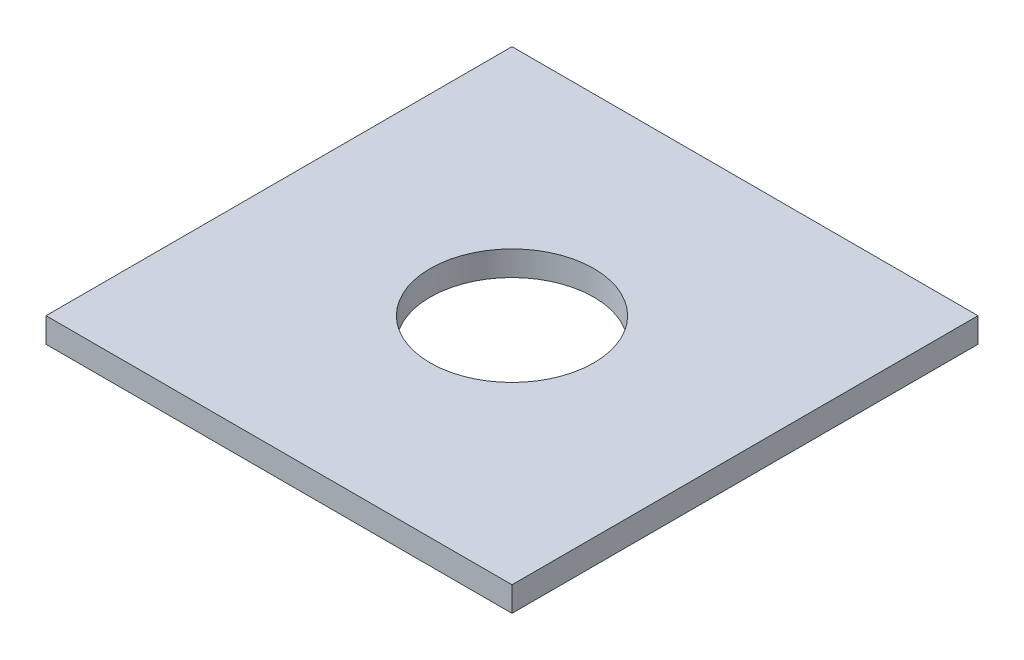
ISO-10303-21;
HEADER;
FILE_DESCRIPTION(('STEP AP214'),'2;1');
FILE_NAME('part.step','',(''),(''),'','','');
FILE_SCHEMA(('AUTOMOTIVE_DESIGN { 1 0 10303 214 1 1 1 1 }'));
ENDSEC;
DATA;
#1=APPLICATION_CONTEXT('core data for automotive mechanical design processes');
#2=APPLICATION_PROTOCOL_DEFINITION('international standard','automotive_design',2000,#1);
#3=PRODUCT_CONTEXT('',#1,'mechanical');
#4=PRODUCT('Part','Part','',(#3));
#5=PRODUCT_RELATED_PRODUCT_CATEGORY('part','',(#4));
#6=PRODUCT_DEFINITION_FORMATION('','',#4);
#7=PRODUCT_DEFINITION_CONTEXT('part definition',#1,'design');
#8=PRODUCT_DEFINITION('design','',#6,#7);
#9=PRODUCT_DEFINITION_SHAPE('','',#8);
#10=(LENGTH_UNIT() NAMED_UNIT(*) SI_UNIT(.MILLI.,.METRE.));
#11=(NAMED_UNIT(*) PLANE_ANGLE_UNIT() SI_UNIT($,.RADIAN.));
#12=(NAMED_UNIT(*) SI_UNIT($,.STERADIAN.) SOLID_ANGLE_UNIT());
#13=UNCERTAINTY_MEASURE_WITH_UNIT(LENGTH_MEASURE(1.E-05),#10,'distance_accuracy_value','');
#14=(GEOMETRIC_REPRESENTATION_CONTEXT(3) GLOBAL_UNCERTAINTY_ASSIGNED_CONTEXT((#13)) GLOBAL_UNIT_ASSIGNED_CONTEXT((#10,
#11,#12)) REPRESENTATION_CONTEXT('',''));
#15=CARTESIAN_POINT('',(0.,0.,0.));
#16=DIRECTION('',(0.,0.,1.));
#17=DIRECTION('',(1.,0.,0.));
#18=AXIS2_PLACEMENT_3D('',#15,#16,#17);
#19=CARTESIAN_POINT('',(47.,5.,47.));
#20=DIRECTION('',(-1.,0.,0.));
#21=DIRECTION('',(0.,0.,1.));
#22=AXIS2_PLACEMENT_3D('',#19,#20,#21);
#23=PLANE('',#22);
#24=DIRECTION('',(0.,0.,-1.));
#25=VECTOR('',#24,1.);
#26=CARTESIAN_POINT('',(47.,0.,47.));
#27=LINE('',#26,#25);
#28=CARTESIAN_POINT('',(47.,0.,47.));
#29=VERTEX_POINT('',#28);
#30=CARTESIAN_POINT('',(47.,0.,-47.));
#31=VERTEX_POINT('',#30);
#32=EDGE_CURVE('E96',#29,#31,#27,.T.);
#33=ORIENTED_EDGE('',*,*,#32,.T.);
#34=DIRECTION('',(0.,-1.,0.));
#35=VECTOR('',#34,1.);
#36=CARTESIAN_POINT('',(47.,5.,-47.));
#37=LINE('',#36,#35);
#38=CARTESIAN_POINT('',(47.,5.,-47.));
#39=VERTEX_POINT('',#38);
#40=EDGE_CURVE('E11',#39,#31,#37,.T.);
#41=ORIENTED_EDGE('',*,*,#40,.F.);
#42=DIRECTION('',(0.,0.,-1.));
#43=VECTOR('',#42,1.);
#44=CARTESIAN_POINT('',(47.,5.,47.));
#45=LINE('',#44,#43);
#46=CARTESIAN_POINT('',(47.,5.,47.));
#47=VERTEX_POINT('',#46);
#48=EDGE_CURVE('E84',#47,#39,#45,.T.);
#49=ORIENTED_EDGE('',*,*,#48,.F.);
#50=DIRECTION('',(0.,-1.,0.));
#51=VECTOR('',#50,1.);
#52=CARTESIAN_POINT('',(47.,5.,47.));
#53=LINE('',#52,#51);
#54=EDGE_CURVE('E92',#47,#29,#53,.T.);
#55=ORIENTED_EDGE('',*,*,#54,.T.);
#56=EDGE_LOOP('',(#33,#41,#49,#55));
#57=FACE_BOUND('',#56,.T.);
#58=ADVANCED_FACE('F33',(#57),#23,.F.);
#59=CARTESIAN_POINT('',(-47.,5.,-47.));
#60=DIRECTION('',(0.,0.,1.));
#61=DIRECTION('',(1.,0.,0.));
#62=AXIS2_PLACEMENT_3D('',#59,#60,#61);
#63=PLANE('',#62);
#64=DIRECTION('',(-1.,0.,0.));
#65=VECTOR('',#64,1.);
#66=CARTESIAN_POINT('',(-47.,0.,-47.));
#67=LINE('',#66,#65);
#68=CARTESIAN_POINT('',(-47.,0.,-47.));
#69=VERTEX_POINT('',#68);
#70=EDGE_CURVE('E88',#31,#69,#67,.T.);
#71=ORIENTED_EDGE('',*,*,#70,.T.);
#72=DIRECTION('',(0.,-1.,0.));
#73=VECTOR('',#72,1.);
#74=CARTESIAN_POINT('',(-47.,5.,-47.));
#75=LINE('',#74,#73);
#76=CARTESIAN_POINT('',(-47.,5.,-47.));
#77=VERTEX_POINT('',#76);
#78=EDGE_CURVE('E41',#77,#69,#75,.T.);
#79=ORIENTED_EDGE('',*,*,#78,.F.);
#80=DIRECTION('',(-1.,0.,0.));
#81=VECTOR('',#80,1.);
#82=CARTESIAN_POINT('',(-47.,5.,-47.));
#83=LINE('',#82,#81);
#84=EDGE_CURVE('E79',#39,#77,#83,.T.);
#85=ORIENTED_EDGE('',*,*,#84,.F.);
#86=ORIENTED_EDGE('',*,*,#40,.T.);
#87=EDGE_LOOP('',(#71,#79,#85,#86));
#88=FACE_BOUND('',#87,.T.);
#89=ADVANCED_FACE('F87',(#88),#63,.F.);
#90=CARTESIAN_POINT('',(-47.,5.,47.));
#91=DIRECTION('',(1.,0.,0.));
#92=DIRECTION('',(0.,0.,-1.));
#93=AXIS2_PLACEMENT_3D('',#90,#91,#92);
#94=PLANE('',#93);
#95=DIRECTION('',(0.,0.,1.));
#96=VECTOR('',#95,1.);
#97=CARTESIAN_POINT('',(-47.,0.,47.));
#98=LINE('',#97,#96);
#99=CARTESIAN_POINT('',(-47.,0.,47.));
#100=VERTEX_POINT('',#99);
#101=EDGE_CURVE('E66',#69,#100,#98,.T.);
#102=ORIENTED_EDGE('',*,*,#101,.T.);
#103=DIRECTION('',(0.,-1.,0.));
#104=VECTOR('',#103,1.);
#105=CARTESIAN_POINT('',(-47.,5.,47.));
#106=LINE('',#105,#104);
#107=CARTESIAN_POINT('',(-47.,5.,47.));
#108=VERTEX_POINT('',#107);
#109=EDGE_CURVE('E89',#108,#100,#106,.T.);
#110=ORIENTED_EDGE('',*,*,#109,.F.);
#111=DIRECTION('',(0.,0.,1.));
#112=VECTOR('',#111,1.);
#113=CARTESIAN_POINT('',(-47.,5.,47.));
#114=LINE('',#113,#112);
#115=EDGE_CURVE('E82',#77,#108,#114,.T.);
#116=ORIENTED_EDGE('',*,*,#115,.F.);
#117=ORIENTED_EDGE('',*,*,#78,.T.);
#118=EDGE_LOOP('',(#102,#110,#116,#117));
#119=FACE_BOUND('',#118,.T.);
#120=ADVANCED_FACE('F90',(#119),#94,.F.);
#121=CARTESIAN_POINT('',(-47.,5.,47.));
#122=DIRECTION('',(0.,0.,-1.));
#123=DIRECTION('',(-1.,0.,0.));
#124=AXIS2_PLACEMENT_3D('',#121,#122,#123);
#125=PLANE('',#124);
#126=DIRECTION('',(1.,0.,0.));
#127=VECTOR('',#126,1.);
#128=CARTESIAN_POINT('',(-47.,0.,47.));
#129=LINE('',#128,#127);
#130=EDGE_CURVE('E72',#100,#29,#129,.T.);
#131=ORIENTED_EDGE('',*,*,#130,.T.);
#132=ORIENTED_EDGE('',*,*,#54,.F.);
#133=DIRECTION('',(1.,0.,0.));
#134=VECTOR('',#133,1.);
#135=CARTESIAN_POINT('',(-47.,5.,47.));
#136=LINE('',#135,#134);
#137=EDGE_CURVE('E49',#108,#47,#136,.T.);
#138=ORIENTED_EDGE('',*,*,#137,.F.);
#139=ORIENTED_EDGE('',*,*,#109,.T.);
#140=EDGE_LOOP('',(#131,#132,#138,#139));
#141=FACE_BOUND('',#140,.T.);
#142=ADVANCED_FACE('F104',(#141),#125,.F.);
#143=CARTESIAN_POINT('',(0.,5.,0.));
#144=DIRECTION('',(0.,-1.,0.));
#145=DIRECTION('',(0.,0.,-1.));
#146=AXIS2_PLACEMENT_3D('',#143,#144,#145);
#147=PLANE('',#146);
#148=CARTESIAN_POINT('',(0.,5.,0.));
#149=DIRECTION('',(0.,1.,0.));
#150=DIRECTION('',(0.,0.,1.));
#151=AXIS2_PLACEMENT_3D('',#148,#149,#150);
#152=CIRCLE('',#151,16.5);
#153=CARTESIAN_POINT('',(0.,5.,16.5));
#154=VERTEX_POINT('',#153);
#155=EDGE_CURVE('E99',#154,#154,#152,.T.);
#156=ORIENTED_EDGE('',*,*,#155,.F.);
#157=EDGE_LOOP('',(#156));
#158=FACE_BOUND('',#157,.T.);
#159=ORIENTED_EDGE('',*,*,#48,.T.);
#160=ORIENTED_EDGE('',*,*,#84,.T.);
#161=ORIENTED_EDGE('',*,*,#115,.T.);
#162=ORIENTED_EDGE('',*,*,#137,.T.);
#163=EDGE_LOOP('',(#159,#160,#161,#162));
#164=FACE_BOUND('',#163,.T.);
#165=ADVANCED_FACE('F80',(#158,#164),#147,.F.);
#166=CARTESIAN_POINT('',(0.,0.,0.));
#167=DIRECTION('',(0.,-1.,0.));
#168=DIRECTION('',(0.,0.,-1.));
#169=AXIS2_PLACEMENT_3D('',#166,#167,#168);
#170=PLANE('',#169);
#171=CARTESIAN_POINT('',(0.,0.,0.));
#172=DIRECTION('',(0.,-1.,0.));
#173=DIRECTION('',(0.,0.,-1.));
#174=AXIS2_PLACEMENT_3D('',#171,#172,#173);
#175=CIRCLE('',#174,16.5);
#176=CARTESIAN_POINT('',(0.,0.,-16.5));
#177=VERTEX_POINT('',#176);
#178=EDGE_CURVE('E110',#177,#177,#175,.F.);
#179=ORIENTED_EDGE('',*,*,#178,.T.);
#180=EDGE_LOOP('',(#179));
#181=FACE_BOUND('',#180,.T.);
#182=ORIENTED_EDGE('',*,*,#32,.F.);
#183=ORIENTED_EDGE('',*,*,#130,.F.);
#184=ORIENTED_EDGE('',*,*,#101,.F.);
#185=ORIENTED_EDGE('',*,*,#70,.F.);
#186=EDGE_LOOP('',(#182,#183,#184,#185));
#187=FACE_BOUND('',#186,.T.);
#188=ADVANCED_FACE('F107',(#181,#187),#170,.T.);
#189=CARTESIAN_POINT('',(0.,-0.00100000000000013,0.));
#190=DIRECTION('',(0.,1.,0.));
#191=DIRECTION('',(0.,0.,1.));
#192=AXIS2_PLACEMENT_3D('',#189,#190,#191);
#193=CYLINDRICAL_SURFACE('',#192,16.5);
#194=ORIENTED_EDGE('',*,*,#178,.F.);
#195=EDGE_LOOP('',(#194));
#196=FACE_BOUND('',#195,.T.);
#197=ORIENTED_EDGE('',*,*,#155,.T.);
#198=EDGE_LOOP('',(#197));
#199=FACE_BOUND('',#198,.T.);
#200=ADVANCED_FACE('F116',(#196,#199),#193,.F.);
#201=CLOSED_SHELL('',(#58,#89,#120,#142,#165,#188,#200));
#202=MANIFOLD_SOLID_BREP('B2',#201);
#203=ADVANCED_BREP_SHAPE_REPRESENTATION('',(#18,#202),#14);
#204=SHAPE_DEFINITION_REPRESENTATION(#9,#203);
ENDSEC;
END-ISO-10303-21;
